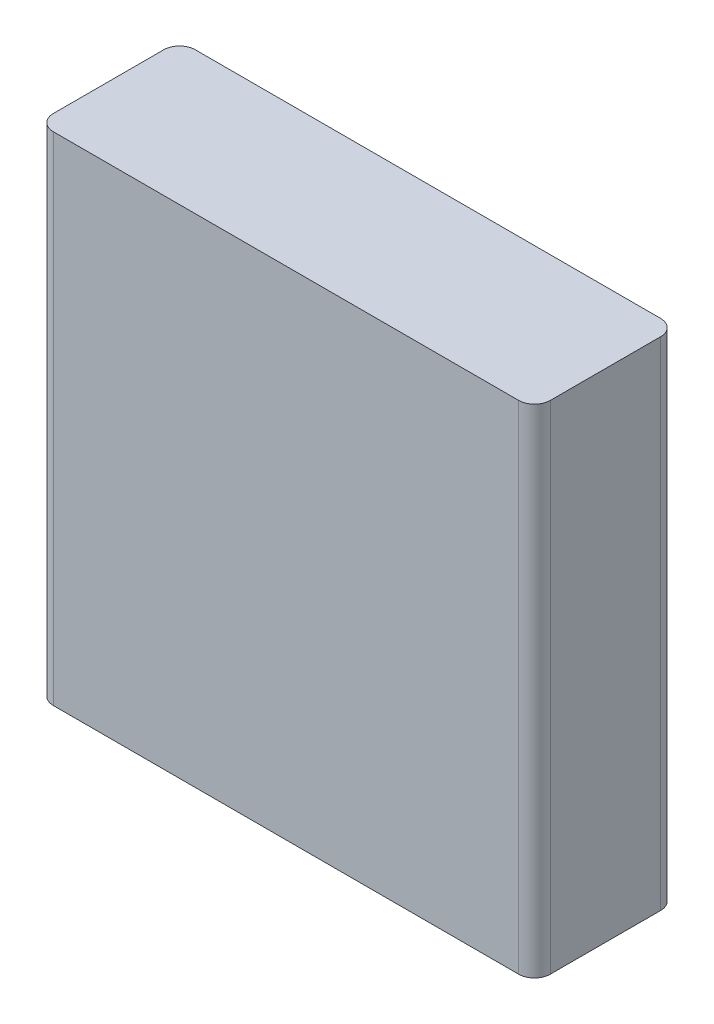
ISO-10303-21;
HEADER;
FILE_DESCRIPTION(('STEP AP214'),'2;1');
FILE_NAME('part.step','',(''),(''),'','','');
FILE_SCHEMA(('AUTOMOTIVE_DESIGN { 1 0 10303 214 1 1 1 1 }'));
ENDSEC;
DATA;
#1=APPLICATION_CONTEXT('core data for automotive mechanical design processes');
#2=APPLICATION_PROTOCOL_DEFINITION('international standard','automotive_design',2000,#1);
#3=PRODUCT_CONTEXT('',#1,'mechanical');
#4=PRODUCT('Part','Part','',(#3));
#5=PRODUCT_RELATED_PRODUCT_CATEGORY('part','',(#4));
#6=PRODUCT_DEFINITION_FORMATION('','',#4);
#7=PRODUCT_DEFINITION_CONTEXT('part definition',#1,'design');
#8=PRODUCT_DEFINITION('design','',#6,#7);
#9=PRODUCT_DEFINITION_SHAPE('','',#8);
#10=(LENGTH_UNIT() NAMED_UNIT(*) SI_UNIT(.MILLI.,.METRE.));
#11=(NAMED_UNIT(*) PLANE_ANGLE_UNIT() SI_UNIT($,.RADIAN.));
#12=(NAMED_UNIT(*) SI_UNIT($,.STERADIAN.) SOLID_ANGLE_UNIT());
#13=UNCERTAINTY_MEASURE_WITH_UNIT(LENGTH_MEASURE(1.E-05),#10,'distance_accuracy_value','');
#14=(GEOMETRIC_REPRESENTATION_CONTEXT(3) GLOBAL_UNCERTAINTY_ASSIGNED_CONTEXT((#13)) GLOBAL_UNIT_ASSIGNED_CONTEXT((#10,
#11,#12)) REPRESENTATION_CONTEXT('',''));
#15=CARTESIAN_POINT('',(0.,0.,0.));
#16=DIRECTION('',(0.,0.,1.));
#17=DIRECTION('',(1.,0.,0.));
#18=AXIS2_PLACEMENT_3D('',#15,#16,#17);
#19=CARTESIAN_POINT('',(0.,63.,18.));
#20=DIRECTION('',(1.,0.,0.));
#21=DIRECTION('',(0.,0.,-1.));
#22=AXIS2_PLACEMENT_3D('',#19,#20,#21);
#23=PLANE('',#22);
#24=DIRECTION('',(0.,0.,-1.));
#25=VECTOR('',#24,1.);
#26=CARTESIAN_POINT('',(0.,63.,18.));
#27=LINE('',#26,#25);
#28=CARTESIAN_POINT('',(0.,63.,16.));
#29=VERTEX_POINT('',#28);
#30=CARTESIAN_POINT('',(0.,63.,2.));
#31=VERTEX_POINT('',#30);
#32=EDGE_CURVE('E160',#29,#31,#27,.T.);
#33=ORIENTED_EDGE('',*,*,#32,.T.);
#34=DIRECTION('',(0.,-1.,0.));
#35=VECTOR('',#34,1.);
#36=CARTESIAN_POINT('',(0.,63.,2.));
#37=LINE('',#36,#35);
#38=CARTESIAN_POINT('',(0.,0.,2.));
#39=VERTEX_POINT('',#38);
#40=EDGE_CURVE('E124',#31,#39,#37,.T.);
#41=ORIENTED_EDGE('',*,*,#40,.T.);
#42=DIRECTION('',(0.,0.,-1.));
#43=VECTOR('',#42,1.);
#44=CARTESIAN_POINT('',(0.,0.,18.));
#45=LINE('',#44,#43);
#46=CARTESIAN_POINT('',(0.,0.,16.));
#47=VERTEX_POINT('',#46);
#48=EDGE_CURVE('E109',#47,#39,#45,.T.);
#49=ORIENTED_EDGE('',*,*,#48,.F.);
#50=DIRECTION('',(0.,-1.,0.));
#51=VECTOR('',#50,1.);
#52=CARTESIAN_POINT('',(0.,63.,16.));
#53=LINE('',#52,#51);
#54=EDGE_CURVE('E121',#47,#29,#53,.F.);
#55=ORIENTED_EDGE('',*,*,#54,.T.);
#56=EDGE_LOOP('',(#33,#41,#49,#55));
#57=FACE_BOUND('',#56,.T.);
#58=ADVANCED_FACE('F39',(#57),#23,.F.);
#59=CARTESIAN_POINT('',(0.,0.,18.));
#60=DIRECTION('',(0.,1.,0.));
#61=DIRECTION('',(0.,0.,1.));
#62=AXIS2_PLACEMENT_3D('',#59,#60,#61);
#63=PLANE('',#62);
#64=ORIENTED_EDGE('',*,*,#48,.T.);
#65=CARTESIAN_POINT('',(2.,0.,2.));
#66=DIRECTION('',(0.,1.,0.));
#67=DIRECTION('',(0.,0.,1.));
#68=AXIS2_PLACEMENT_3D('',#65,#66,#67);
#69=CIRCLE('',#68,2.);
#70=CARTESIAN_POINT('',(2.,0.,0.));
#71=VERTEX_POINT('',#70);
#72=EDGE_CURVE('E136',#39,#71,#69,.F.);
#73=ORIENTED_EDGE('',*,*,#72,.T.);
#74=DIRECTION('',(1.,0.,0.));
#75=VECTOR('',#74,1.);
#76=CARTESIAN_POINT('',(0.,0.,0.));
#77=LINE('',#76,#75);
#78=CARTESIAN_POINT('',(61.,0.,0.));
#79=VERTEX_POINT('',#78);
#80=EDGE_CURVE('E167',#71,#79,#77,.T.);
#81=ORIENTED_EDGE('',*,*,#80,.T.);
#82=CARTESIAN_POINT('',(61.,0.,2.));
#83=DIRECTION('',(0.,1.,0.));
#84=DIRECTION('',(0.,0.,1.));
#85=AXIS2_PLACEMENT_3D('',#82,#83,#84);
#86=CIRCLE('',#85,2.);
#87=CARTESIAN_POINT('',(63.,0.,2.));
#88=VERTEX_POINT('',#87);
#89=EDGE_CURVE('E115',#79,#88,#86,.F.);
#90=ORIENTED_EDGE('',*,*,#89,.T.);
#91=DIRECTION('',(0.,0.,-1.));
#92=VECTOR('',#91,1.);
#93=CARTESIAN_POINT('',(63.,0.,18.));
#94=LINE('',#93,#92);
#95=CARTESIAN_POINT('',(63.,0.,16.));
#96=VERTEX_POINT('',#95);
#97=EDGE_CURVE('E125',#96,#88,#94,.T.);
#98=ORIENTED_EDGE('',*,*,#97,.F.);
#99=CARTESIAN_POINT('',(61.,0.,16.));
#100=DIRECTION('',(0.,1.,0.));
#101=DIRECTION('',(0.,0.,1.));
#102=AXIS2_PLACEMENT_3D('',#99,#100,#101);
#103=CIRCLE('',#102,2.);
#104=CARTESIAN_POINT('',(61.,0.,18.));
#105=VERTEX_POINT('',#104);
#106=EDGE_CURVE('E116',#96,#105,#103,.F.);
#107=ORIENTED_EDGE('',*,*,#106,.T.);
#108=DIRECTION('',(1.,0.,0.));
#109=VECTOR('',#108,1.);
#110=CARTESIAN_POINT('',(0.,0.,18.));
#111=LINE('',#110,#109);
#112=CARTESIAN_POINT('',(2.,0.,18.));
#113=VERTEX_POINT('',#112);
#114=EDGE_CURVE('E111',#113,#105,#111,.T.);
#115=ORIENTED_EDGE('',*,*,#114,.F.);
#116=CARTESIAN_POINT('',(2.,0.,16.));
#117=DIRECTION('',(0.,1.,0.));
#118=DIRECTION('',(0.,0.,1.));
#119=AXIS2_PLACEMENT_3D('',#116,#117,#118);
#120=CIRCLE('',#119,2.);
#121=EDGE_CURVE('E106',#113,#47,#120,.F.);
#122=ORIENTED_EDGE('',*,*,#121,.T.);
#123=EDGE_LOOP('',(#64,#73,#81,#90,#98,#107,#115,#122));
#124=FACE_BOUND('',#123,.T.);
#125=ADVANCED_FACE('F108',(#124),#63,.F.);
#126=CARTESIAN_POINT('',(63.,0.,18.));
#127=DIRECTION('',(-1.,0.,0.));
#128=DIRECTION('',(0.,0.,1.));
#129=AXIS2_PLACEMENT_3D('',#126,#127,#128);
#130=PLANE('',#129);
#131=ORIENTED_EDGE('',*,*,#97,.T.);
#132=DIRECTION('',(0.,1.,0.));
#133=VECTOR('',#132,1.);
#134=CARTESIAN_POINT('',(63.,0.,2.));
#135=LINE('',#134,#133);
#136=CARTESIAN_POINT('',(63.,63.,2.));
#137=VERTEX_POINT('',#136);
#138=EDGE_CURVE('E149',#88,#137,#135,.T.);
#139=ORIENTED_EDGE('',*,*,#138,.T.);
#140=DIRECTION('',(0.,0.,-1.));
#141=VECTOR('',#140,1.);
#142=CARTESIAN_POINT('',(63.,63.,18.));
#143=LINE('',#142,#141);
#144=CARTESIAN_POINT('',(63.,63.,16.));
#145=VERTEX_POINT('',#144);
#146=EDGE_CURVE('E162',#145,#137,#143,.T.);
#147=ORIENTED_EDGE('',*,*,#146,.F.);
#148=DIRECTION('',(0.,1.,0.));
#149=VECTOR('',#148,1.);
#150=CARTESIAN_POINT('',(63.,0.,16.));
#151=LINE('',#150,#149);
#152=EDGE_CURVE('E147',#145,#96,#151,.F.);
#153=ORIENTED_EDGE('',*,*,#152,.T.);
#154=EDGE_LOOP('',(#131,#139,#147,#153));
#155=FACE_BOUND('',#154,.T.);
#156=ADVANCED_FACE('F174',(#155),#130,.F.);
#157=CARTESIAN_POINT('',(63.,63.,18.));
#158=DIRECTION('',(0.,-1.,0.));
#159=DIRECTION('',(0.,0.,-1.));
#160=AXIS2_PLACEMENT_3D('',#157,#158,#159);
#161=PLANE('',#160);
#162=DIRECTION('',(-1.,0.,0.));
#163=VECTOR('',#162,1.);
#164=CARTESIAN_POINT('',(63.,63.,0.));
#165=LINE('',#164,#163);
#166=CARTESIAN_POINT('',(61.,63.,0.));
#167=VERTEX_POINT('',#166);
#168=CARTESIAN_POINT('',(2.,63.,0.));
#169=VERTEX_POINT('',#168);
#170=EDGE_CURVE('E164',#167,#169,#165,.T.);
#171=ORIENTED_EDGE('',*,*,#170,.T.);
#172=CARTESIAN_POINT('',(2.,63.,2.));
#173=DIRECTION('',(0.,-1.,0.));
#174=DIRECTION('',(0.,0.,-1.));
#175=AXIS2_PLACEMENT_3D('',#172,#173,#174);
#176=CIRCLE('',#175,2.);
#177=EDGE_CURVE('E145',#169,#31,#176,.F.);
#178=ORIENTED_EDGE('',*,*,#177,.T.);
#179=ORIENTED_EDGE('',*,*,#32,.F.);
#180=CARTESIAN_POINT('',(2.,63.,16.));
#181=DIRECTION('',(0.,-1.,0.));
#182=DIRECTION('',(0.,0.,-1.));
#183=AXIS2_PLACEMENT_3D('',#180,#181,#182);
#184=CIRCLE('',#183,2.);
#185=CARTESIAN_POINT('',(2.,63.,18.));
#186=VERTEX_POINT('',#185);
#187=EDGE_CURVE('E129',#29,#186,#184,.F.);
#188=ORIENTED_EDGE('',*,*,#187,.T.);
#189=DIRECTION('',(-1.,0.,0.));
#190=VECTOR('',#189,1.);
#191=CARTESIAN_POINT('',(63.,63.,18.));
#192=LINE('',#191,#190);
#193=CARTESIAN_POINT('',(61.,63.,18.));
#194=VERTEX_POINT('',#193);
#195=EDGE_CURVE('E155',#194,#186,#192,.T.);
#196=ORIENTED_EDGE('',*,*,#195,.F.);
#197=CARTESIAN_POINT('',(61.,63.,16.));
#198=DIRECTION('',(0.,-1.,0.));
#199=DIRECTION('',(0.,0.,-1.));
#200=AXIS2_PLACEMENT_3D('',#197,#198,#199);
#201=CIRCLE('',#200,2.);
#202=EDGE_CURVE('E62',#194,#145,#201,.F.);
#203=ORIENTED_EDGE('',*,*,#202,.T.);
#204=ORIENTED_EDGE('',*,*,#146,.T.);
#205=CARTESIAN_POINT('',(61.,63.,2.));
#206=DIRECTION('',(0.,-1.,0.));
#207=DIRECTION('',(0.,0.,-1.));
#208=AXIS2_PLACEMENT_3D('',#205,#206,#207);
#209=CIRCLE('',#208,2.);
#210=EDGE_CURVE('E54',#137,#167,#209,.F.);
#211=ORIENTED_EDGE('',*,*,#210,.T.);
#212=EDGE_LOOP('',(#171,#178,#179,#188,#196,#203,#204,#211));
#213=FACE_BOUND('',#212,.T.);
#214=ADVANCED_FACE('F159',(#213),#161,.F.);
#215=CARTESIAN_POINT('',(0.,0.,18.));
#216=DIRECTION('',(0.,0.,1.));
#217=DIRECTION('',(1.,0.,0.));
#218=AXIS2_PLACEMENT_3D('',#215,#216,#217);
#219=PLANE('',#218);
#220=ORIENTED_EDGE('',*,*,#195,.T.);
#221=DIRECTION('',(0.,-1.,0.));
#222=VECTOR('',#221,1.);
#223=CARTESIAN_POINT('',(2.,0.,18.));
#224=LINE('',#223,#222);
#225=EDGE_CURVE('E11',#186,#113,#224,.T.);
#226=ORIENTED_EDGE('',*,*,#225,.T.);
#227=ORIENTED_EDGE('',*,*,#114,.T.);
#228=DIRECTION('',(0.,1.,0.));
#229=VECTOR('',#228,1.);
#230=CARTESIAN_POINT('',(61.,63.,18.));
#231=LINE('',#230,#229);
#232=EDGE_CURVE('E47',#105,#194,#231,.T.);
#233=ORIENTED_EDGE('',*,*,#232,.T.);
#234=EDGE_LOOP('',(#220,#226,#227,#233));
#235=FACE_BOUND('',#234,.T.);
#236=ADVANCED_FACE('F154',(#235),#219,.T.);
#237=CARTESIAN_POINT('',(0.,0.,0.));
#238=DIRECTION('',(0.,0.,1.));
#239=DIRECTION('',(1.,0.,0.));
#240=AXIS2_PLACEMENT_3D('',#237,#238,#239);
#241=PLANE('',#240);
#242=ORIENTED_EDGE('',*,*,#80,.F.);
#243=DIRECTION('',(0.,-1.,0.));
#244=VECTOR('',#243,1.);
#245=CARTESIAN_POINT('',(2.,0.,0.));
#246=LINE('',#245,#244);
#247=EDGE_CURVE('E140',#71,#169,#246,.F.);
#248=ORIENTED_EDGE('',*,*,#247,.T.);
#249=ORIENTED_EDGE('',*,*,#170,.F.);
#250=DIRECTION('',(0.,1.,0.));
#251=VECTOR('',#250,1.);
#252=CARTESIAN_POINT('',(61.,0.,0.));
#253=LINE('',#252,#251);
#254=EDGE_CURVE('E138',#167,#79,#253,.F.);
#255=ORIENTED_EDGE('',*,*,#254,.T.);
#256=EDGE_LOOP('',(#242,#248,#249,#255));
#257=FACE_BOUND('',#256,.T.);
#258=ADVANCED_FACE('F181',(#257),#241,.F.);
#259=CARTESIAN_POINT('',(2.,63.,2.));
#260=DIRECTION('',(0.,-1.,0.));
#261=DIRECTION('',(0.,0.,-1.));
#262=AXIS2_PLACEMENT_3D('',#259,#260,#261);
#263=CYLINDRICAL_SURFACE('',#262,2.);
#264=ORIENTED_EDGE('',*,*,#177,.F.);
#265=ORIENTED_EDGE('',*,*,#247,.F.);
#266=ORIENTED_EDGE('',*,*,#72,.F.);
#267=ORIENTED_EDGE('',*,*,#40,.F.);
#268=EDGE_LOOP('',(#264,#265,#266,#267));
#269=FACE_BOUND('',#268,.T.);
#270=ADVANCED_FACE('F185',(#269),#263,.T.);
#271=CARTESIAN_POINT('',(61.,0.,2.));
#272=DIRECTION('',(0.,1.,0.));
#273=DIRECTION('',(0.,0.,1.));
#274=AXIS2_PLACEMENT_3D('',#271,#272,#273);
#275=CYLINDRICAL_SURFACE('',#274,2.);
#276=ORIENTED_EDGE('',*,*,#89,.F.);
#277=ORIENTED_EDGE('',*,*,#254,.F.);
#278=ORIENTED_EDGE('',*,*,#210,.F.);
#279=ORIENTED_EDGE('',*,*,#138,.F.);
#280=EDGE_LOOP('',(#276,#277,#278,#279));
#281=FACE_BOUND('',#280,.T.);
#282=ADVANCED_FACE('F177',(#281),#275,.T.);
#283=CARTESIAN_POINT('',(2.,0.,16.));
#284=DIRECTION('',(0.,1.,0.));
#285=DIRECTION('',(0.,0.,1.));
#286=AXIS2_PLACEMENT_3D('',#283,#284,#285);
#287=CYLINDRICAL_SURFACE('',#286,2.);
#288=ORIENTED_EDGE('',*,*,#187,.F.);
#289=ORIENTED_EDGE('',*,*,#54,.F.);
#290=ORIENTED_EDGE('',*,*,#121,.F.);
#291=ORIENTED_EDGE('',*,*,#225,.F.);
#292=EDGE_LOOP('',(#288,#289,#290,#291));
#293=FACE_BOUND('',#292,.T.);
#294=ADVANCED_FACE('F128',(#293),#287,.T.);
#295=CARTESIAN_POINT('',(61.,0.,16.));
#296=DIRECTION('',(0.,-1.,0.));
#297=DIRECTION('',(0.,0.,-1.));
#298=AXIS2_PLACEMENT_3D('',#295,#296,#297);
#299=CYLINDRICAL_SURFACE('',#298,2.);
#300=ORIENTED_EDGE('',*,*,#106,.F.);
#301=ORIENTED_EDGE('',*,*,#152,.F.);
#302=ORIENTED_EDGE('',*,*,#202,.F.);
#303=ORIENTED_EDGE('',*,*,#232,.F.);
#304=EDGE_LOOP('',(#300,#301,#302,#303));
#305=FACE_BOUND('',#304,.T.);
#306=ADVANCED_FACE('F41',(#305),#299,.T.);
#307=CLOSED_SHELL('',(#58,#125,#156,#214,#236,#258,#270,#282,#294,#306));
#308=MANIFOLD_SOLID_BREP('B2',#307);
#309=ADVANCED_BREP_SHAPE_REPRESENTATION('',(#18,#308),#14);
#310=SHAPE_DEFINITION_REPRESENTATION(#9,#309);
ENDSEC;
END-ISO-10303-21;
